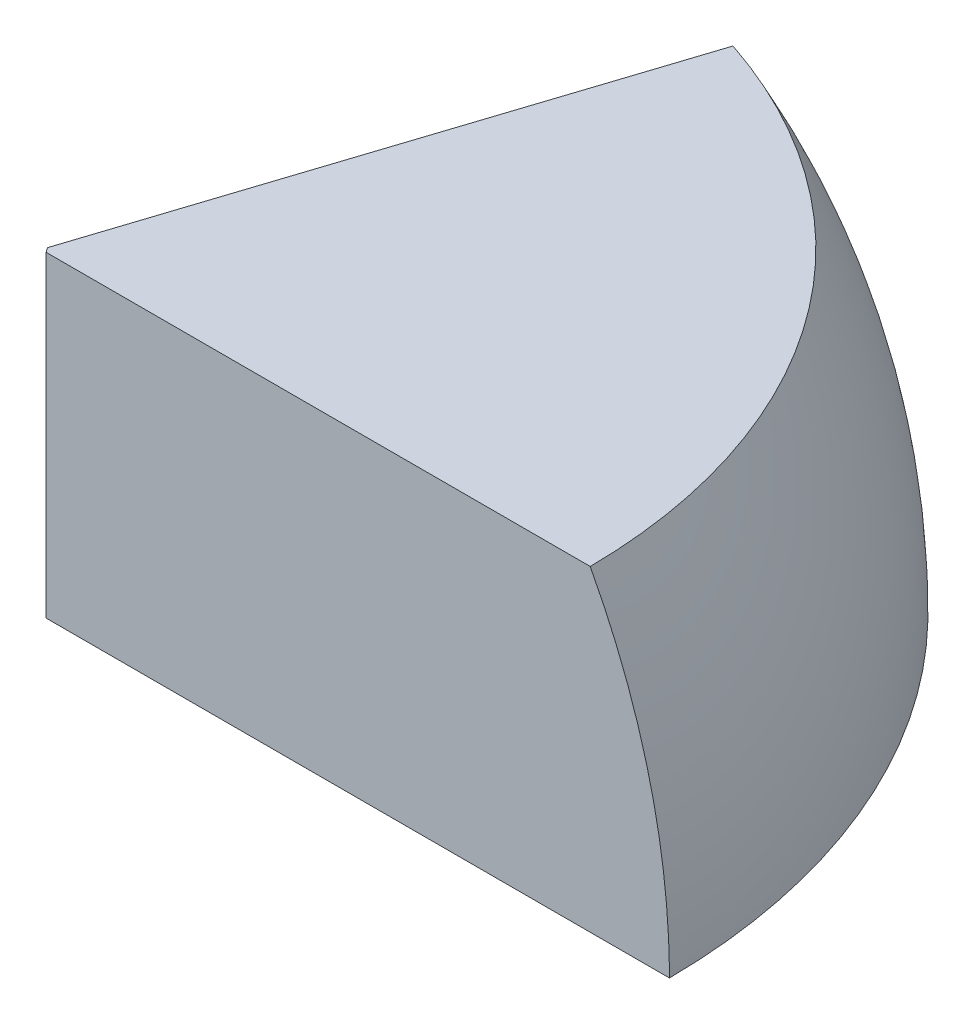
ISO-10303-21;
HEADER;
FILE_DESCRIPTION(('STEP AP214'),'2;1');
FILE_NAME('part.step','',(''),(''),'','','');
FILE_SCHEMA(('AUTOMOTIVE_DESIGN { 1 0 10303 214 1 1 1 1 }'));
ENDSEC;
DATA;
#1=APPLICATION_CONTEXT('core data for automotive mechanical design processes');
#2=APPLICATION_PROTOCOL_DEFINITION('international standard','automotive_design',2000,#1);
#3=PRODUCT_CONTEXT('',#1,'mechanical');
#4=PRODUCT('Part','Part','',(#3));
#5=PRODUCT_RELATED_PRODUCT_CATEGORY('part','',(#4));
#6=PRODUCT_DEFINITION_FORMATION('','',#4);
#7=PRODUCT_DEFINITION_CONTEXT('part definition',#1,'design');
#8=PRODUCT_DEFINITION('design','',#6,#7);
#9=PRODUCT_DEFINITION_SHAPE('','',#8);
#10=(LENGTH_UNIT() NAMED_UNIT(*) SI_UNIT(.MILLI.,.METRE.));
#11=(NAMED_UNIT(*) PLANE_ANGLE_UNIT() SI_UNIT($,.RADIAN.));
#12=(NAMED_UNIT(*) SI_UNIT($,.STERADIAN.) SOLID_ANGLE_UNIT());
#13=UNCERTAINTY_MEASURE_WITH_UNIT(LENGTH_MEASURE(1.E-05),#10,'distance_accuracy_value','');
#14=(GEOMETRIC_REPRESENTATION_CONTEXT(3) GLOBAL_UNCERTAINTY_ASSIGNED_CONTEXT((#13)) GLOBAL_UNIT_ASSIGNED_CONTEXT((#10,
#11,#12)) REPRESENTATION_CONTEXT('',''));
#15=CARTESIAN_POINT('',(0.,0.,0.));
#16=DIRECTION('',(0.,0.,1.));
#17=DIRECTION('',(1.,0.,0.));
#18=AXIS2_PLACEMENT_3D('',#15,#16,#17);
#19=CARTESIAN_POINT('',(0.,0.,0.));
#20=DIRECTION('',(0.,-1.,0.));
#21=DIRECTION('',(0.,0.,-1.));
#22=AXIS2_PLACEMENT_3D('',#19,#20,#21);
#23=PLANE('',#22);
#24=DIRECTION('',(-0.587785252292474,0.,-0.809016994374947));
#25=VECTOR('',#24,1.);
#26=CARTESIAN_POINT('',(1.11655093664301,0.,-1.38148727041144));
#27=LINE('',#26,#25);
#28=CARTESIAN_POINT('',(1.65890568521156,0.,-0.635));
#29=VERTEX_POINT('',#28);
#30=CARTESIAN_POINT('',(1.11655093664301,0.,-1.38148727041146));
#31=VERTEX_POINT('',#30);
#32=EDGE_CURVE('E48',#29,#31,#27,.T.);
#33=ORIENTED_EDGE('',*,*,#32,.T.);
#34=DIRECTION('',(-0.309016994374945,0.,0.951056516295154));
#35=VECTOR('',#34,1.);
#36=CARTESIAN_POINT('',(32.0000475163418,0.,-96.4311162641596));
#37=LINE('',#36,#35);
#38=CARTESIAN_POINT('',(31.9994343047552,0.,-96.4292289929545));
#39=VERTEX_POINT('',#38);
#40=EDGE_CURVE('E83',#39,#31,#37,.T.);
#41=ORIENTED_EDGE('',*,*,#40,.F.);
#42=CARTESIAN_POINT('',(0.,0.,0.));
#43=DIRECTION('',(0.,-1.,0.));
#44=DIRECTION('',(0.,0.,-1.));
#45=AXIS2_PLACEMENT_3D('',#42,#43,#44);
#46=CIRCLE('',#45,101.6);
#47=CARTESIAN_POINT('',(101.598015605621,0.,-0.635));
#48=VERTEX_POINT('',#47);
#49=EDGE_CURVE('E41',#39,#48,#46,.T.);
#50=ORIENTED_EDGE('',*,*,#49,.T.);
#51=DIRECTION('',(1.,0.,0.));
#52=VECTOR('',#51,1.);
#53=CARTESIAN_POINT('',(0.667678512391301,0.,-0.635));
#54=LINE('',#53,#52);
#55=EDGE_CURVE('E85',#29,#48,#54,.T.);
#56=ORIENTED_EDGE('',*,*,#55,.F.);
#57=EDGE_LOOP('',(#33,#41,#50,#56));
#58=FACE_BOUND('',#57,.T.);
#59=ADVANCED_FACE('F33',(#58),#23,.T.);
#60=CARTESIAN_POINT('',(0.,50.8,0.));
#61=DIRECTION('',(0.,1.,0.));
#62=DIRECTION('',(0.,0.,1.));
#63=AXIS2_PLACEMENT_3D('',#60,#61,#62);
#64=PLANE('',#63);
#65=DIRECTION('',(-0.587785252292474,0.,-0.809016994374947));
#66=VECTOR('',#65,1.);
#67=CARTESIAN_POINT('',(1.11655093664301,50.8,-1.38148727041144));
#68=LINE('',#67,#66);
#69=CARTESIAN_POINT('',(1.65890568521156,50.8,-0.635));
#70=VERTEX_POINT('',#69);
#71=CARTESIAN_POINT('',(1.11655093664301,50.8,-1.38148727041144));
#72=VERTEX_POINT('',#71);
#73=EDGE_CURVE('E75',#70,#72,#68,.T.);
#74=ORIENTED_EDGE('',*,*,#73,.F.);
#75=DIRECTION('',(-1.,0.,0.));
#76=VECTOR('',#75,1.);
#77=CARTESIAN_POINT('',(88.9,50.8,-0.635));
#78=LINE('',#77,#76);
#79=CARTESIAN_POINT('',(88.8977321139296,50.8,-0.635));
#80=VERTEX_POINT('',#79);
#81=EDGE_CURVE('E119',#80,#70,#78,.T.);
#82=ORIENTED_EDGE('',*,*,#81,.F.);
#83=CARTESIAN_POINT('',(0.,50.8,0.));
#84=DIRECTION('',(0.,-1.,0.));
#85=DIRECTION('',(0.,0.,-1.));
#86=AXIS2_PLACEMENT_3D('',#83,#84,#85);
#87=CIRCLE('',#86,88.9);
#88=CARTESIAN_POINT('',(28.074830872443,50.8,-84.3505416193857));
#89=VERTEX_POINT('',#88);
#90=EDGE_CURVE('E11',#89,#80,#87,.T.);
#91=ORIENTED_EDGE('',*,*,#90,.F.);
#92=DIRECTION('',(0.309016994374945,0.,-0.951056516295154));
#93=VECTOR('',#92,1.);
#94=CARTESIAN_POINT('',(0.603920887847423,50.8,0.19622579142809));
#95=LINE('',#94,#93);
#96=EDGE_CURVE('E56',#72,#89,#95,.T.);
#97=ORIENTED_EDGE('',*,*,#96,.F.);
#98=EDGE_LOOP('',(#74,#82,#91,#97));
#99=FACE_BOUND('',#98,.T.);
#100=ADVANCED_FACE('F35',(#99),#64,.T.);
#101=CARTESIAN_POINT('',(0.,0.,0.));
#102=DIRECTION('',(0.,-1.,0.));
#103=DIRECTION('',(0.,0.,-1.));
#104=AXIS2_PLACEMENT_3D('',#101,#102,#103);
#105=DEGENERATE_TOROIDAL_SURFACE('',#104,6.35000000000002,107.95,.F.);
#106=ORIENTED_EDGE('',*,*,#90,.T.);
#107=CARTESIAN_POINT('',(94.7999608499927,37.7022238875538,-0.635));
#108=CARTESIAN_POINT('',(95.3203908696051,36.3059902496333,-0.635));
#109=CARTESIAN_POINT('',(95.8118771845128,34.8990517011426,-0.635));
#110=CARTESIAN_POINT('',(96.7361397335234,32.0661800949635,-0.635));
#111=CARTESIAN_POINT('',(97.168923614608,30.6402495379324,-0.635));
#112=CARTESIAN_POINT('',(97.9751822661061,27.7713912898887,-0.635));
#113=CARTESIAN_POINT('',(98.348643967202,26.3284599284209,-0.635));
#114=CARTESIAN_POINT('',(99.0355206484872,23.4283195326901,-0.635));
#115=CARTESIAN_POINT('',(99.3489335450704,21.9711100048389,-0.635));
#116=CARTESIAN_POINT('',(99.9154613305407,19.0433948855513,-0.635));
#117=CARTESIAN_POINT('',(100.168511166463,17.5728767064404,-0.635));
#118=CARTESIAN_POINT('',(100.6134643388,14.6224834428879,-0.635));
#119=CARTESIAN_POINT('',(100.805362190253,13.1426075312486,-0.635));
#120=CARTESIAN_POINT('',(101.127630683367,10.1763554045649,-0.635));
#121=CARTESIAN_POINT('',(101.258008893998,8.68998001189637,-0.635));
#122=CARTESIAN_POINT('',(101.457058405799,5.71296530630253,-0.635));
#123=CARTESIAN_POINT('',(101.525723939242,4.22232560788919,-0.635));
#124=CARTESIAN_POINT('',(101.601859762706,1.21376058977976,-0.635));
#125=CARTESIAN_POINT('',(101.608254553608,-0.304192057610666,-0.635));
#126=CARTESIAN_POINT('',(101.557032755509,-3.33915976269332,-0.635));
#127=CARTESIAN_POINT('',(101.499410072898,-4.85617471737609,-0.635));
#128=CARTESIAN_POINT('',(101.320252547292,-7.88631835875365,-0.635));
#129=CARTESIAN_POINT('',(101.198722244482,-9.39944731384866,-0.635));
#130=CARTESIAN_POINT('',(100.891954210238,-12.4193759712748,-0.635));
#131=CARTESIAN_POINT('',(100.706710517596,-13.9261750680086,-0.635));
#132=CARTESIAN_POINT('',(100.272951479846,-16.9298977594043,-0.635));
#133=CARTESIAN_POINT('',(100.024466725546,-18.4268257707399,-0.635));
#134=CARTESIAN_POINT('',(99.4646011814536,-21.4090108637792,-0.635));
#135=CARTESIAN_POINT('',(99.1532145140556,-22.8942668413548,-0.635));
#136=CARTESIAN_POINT('',(98.4681335835209,-25.850209601262,-0.635));
#137=CARTESIAN_POINT('',(98.0944455918392,-27.3208978342598,-0.635));
#138=CARTESIAN_POINT('',(97.2854185769139,-30.2452587836484,-0.635));
#139=CARTESIAN_POINT('',(96.8500737869555,-31.698929894656,-0.635));
#140=CARTESIAN_POINT('',(95.4528377234414,-36.0298740204496,-0.635));
#141=CARTESIAN_POINT('',(94.3994739621603,-38.8782455936228,-0.635));
#142=CARTESIAN_POINT('',(92.0567206952393,-44.4758027316669,-0.635));
#143=CARTESIAN_POINT('',(90.7673300220942,-47.2249878058319,-0.635));
#144=CARTESIAN_POINT('',(87.9607473762117,-52.6067390140956,-0.635));
#145=CARTESIAN_POINT('',(86.4434109690583,-55.2392298270297,-0.635));
#146=CARTESIAN_POINT('',(83.1920506351196,-60.3672396774786,-0.635));
#147=CARTESIAN_POINT('',(81.4580290887038,-62.8627602192311,-0.635));
#148=CARTESIAN_POINT('',(78.7039542070773,-66.489855146637,-0.635));
#149=CARTESIAN_POINT('',(77.7600267570763,-67.6799610127351,-0.635));
#150=CARTESIAN_POINT('',(75.8228288096577,-70.0192607493527,-0.635));
#151=CARTESIAN_POINT('',(74.829562943604,-71.1684584425758,-0.635));
#152=CARTESIAN_POINT('',(72.7953090917599,-73.42405088478,-0.635));
#153=CARTESIAN_POINT('',(71.754314745944,-74.5304398928869,-0.635));
#154=CARTESIAN_POINT('',(69.6266626641089,-76.698210234682,-0.635));
#155=CARTESIAN_POINT('',(68.5400092237349,-77.7595957835402,-0.635));
#156=CARTESIAN_POINT('',(66.3245890887845,-79.8339781628021,-0.635));
#157=CARTESIAN_POINT('',(65.1958895543096,-80.8470467251894,-0.635));
#158=CARTESIAN_POINT('',(62.8969209227435,-82.8246420543714,-0.635));
#159=CARTESIAN_POINT('',(61.7266557305908,-83.7891733605924,-0.635));
#160=CARTESIAN_POINT('',(59.3465843351518,-85.6680429552838,-0.635));
#161=CARTESIAN_POINT('',(58.1367798120026,-86.5823833720931,-0.635));
#162=CARTESIAN_POINT('',(55.6798446306929,-88.3592093754092,-0.635));
#163=CARTESIAN_POINT('',(54.4327174699391,-89.2216997979953,-0.635));
#164=CARTESIAN_POINT('',(51.9044354476268,-90.8925991990847,-0.635));
#165=CARTESIAN_POINT('',(50.6233137804221,-91.7010584054202,-0.635));
#166=CARTESIAN_POINT('',(48.0283067432649,-93.2632789067282,-0.635));
#167=CARTESIAN_POINT('',(46.7144244423366,-94.0170452996619,-0.635));
#168=CARTESIAN_POINT('',(44.0554243349739,-95.4690012522521,-0.635));
#169=CARTESIAN_POINT('',(42.7102908134036,-96.1671620326812,-0.635));
#170=CARTESIAN_POINT('',(39.9919517355716,-97.5061751863875,-0.635));
#171=CARTESIAN_POINT('',(38.6187487996565,-98.1470328792975,-0.635));
#172=CARTESIAN_POINT('',(35.8411894560375,-99.3727565581276,-0.635));
#173=CARTESIAN_POINT('',(34.4367326158972,-99.9573949646777,-0.635));
#174=CARTESIAN_POINT('',(31.604311136439,-101.066819967976,-0.635));
#175=CARTESIAN_POINT('',(30.1763456164377,-101.591604316603,-0.635));
#176=CARTESIAN_POINT('',(27.3012151215215,-102.579771580649,-0.635));
#177=CARTESIAN_POINT('',(25.8540746889027,-103.043225948769,-0.635));
#178=CARTESIAN_POINT('',(22.9416621624144,-103.908584222053,-0.635));
#179=CARTESIAN_POINT('',(21.4763924342036,-104.31049606812,-0.635));
#180=CARTESIAN_POINT('',(19.1816761709061,-104.888119870422,-0.635));
#181=CARTESIAN_POINT('',(18.3575656466681,-105.085271750726,-0.635));
#182=CARTESIAN_POINT('',(16.704859249313,-105.460124421302,-0.635));
#183=CARTESIAN_POINT('',(15.8762630638558,-105.637823838314,-0.635));
#184=CARTESIAN_POINT('',(14.2135857945324,-105.973956279603,-0.635));
#185=CARTESIAN_POINT('',(13.3794974414568,-106.132353396563,-0.635));
#186=CARTESIAN_POINT('',(12.1258839468932,-106.355113988122,-0.635));
#187=CARTESIAN_POINT('',(11.707662641772,-106.426885284225,-0.635));
#188=CARTESIAN_POINT('',(10.8704056470081,-106.565481878848,-0.635));
#189=CARTESIAN_POINT('',(10.4513699699814,-106.632307253371,-0.635));
#190=CARTESIAN_POINT('',(9.61543192797793,-106.760555888908,-0.635));
#191=CARTESIAN_POINT('',(9.19853478818469,-106.822013236501,-0.635));
#192=CARTESIAN_POINT('',(8.36402499664367,-106.94002680085,-0.635));
#193=CARTESIAN_POINT('',(7.94641230865095,-106.996582761372,-0.635));
#194=CARTESIAN_POINT('',(7.11010503857731,-107.104829643146,-0.635));
#195=CARTESIAN_POINT('',(6.69140977816152,-107.156515324557,-0.635));
#196=CARTESIAN_POINT('',(5.85351033204919,-107.254917281929,-0.635));
#197=CARTESIAN_POINT('',(5.43430624841411,-107.301634427289,-0.635));
#198=CARTESIAN_POINT('',(4.59674689887297,-107.389917338872,-0.635));
#199=CARTESIAN_POINT('',(4.17839336859376,-107.43149952392,-0.635));
#200=CARTESIAN_POINT('',(3.5503783917972,-107.490058102203,-0.635));
#201=CARTESIAN_POINT('',(3.34089380415805,-107.508947146425,-0.635));
#202=CARTESIAN_POINT('',(2.92182611393838,-107.545405398607,-0.635));
#203=CARTESIAN_POINT('',(2.7122430204076,-107.562974710314,-0.635));
#204=CARTESIAN_POINT('',(2.29339780669155,-107.596684724307,-0.635));
#205=CARTESIAN_POINT('',(2.08413591934334,-107.612828306571,-0.635));
#206=CARTESIAN_POINT('',(1.77012355845447,-107.635843556175,-0.635));
#207=CARTESIAN_POINT('',(1.6654170208456,-107.643316323744,-0.635));
#208=CARTESIAN_POINT('',(1.45597349782732,-107.657797219578,-0.635));
#209=CARTESIAN_POINT('',(1.35123651296697,-107.664805355756,-0.635));
#210=CARTESIAN_POINT('',(1.14185746907192,-107.678232926634,-0.635));
#211=CARTESIAN_POINT('',(1.03721545767713,-107.684653095224,-0.635));
#212=CARTESIAN_POINT('',(0.8278756101987,-107.696672183818,-0.635));
#213=CARTESIAN_POINT('',(0.72317777030646,-107.702271037821,-0.635));
#214=CARTESIAN_POINT('',(0.513779070818093,-107.712089897921,-0.635));
#215=CARTESIAN_POINT('',(0.409078256436661,-107.71631078816,-0.635));
#216=CARTESIAN_POINT('',(0.251981511151455,-107.720750223907,-0.635));
#217=CARTESIAN_POINT('',(0.199613355256506,-107.721914698276,-0.635));
#218=CARTESIAN_POINT('',(0.0948658082523143,-107.723453214523,-0.635));
#219=CARTESIAN_POINT('',(0.0424864173559474,-107.723827270247,-0.635));
#220=CARTESIAN_POINT('',(-0.0815062755837158,-107.723698022747,-0.635));
#221=CARTESIAN_POINT('',(-0.153119357342319,-107.722822099632,-0.635));
#222=CARTESIAN_POINT('',(-0.296317215844109,-107.719714883284,-0.635));
#223=CARTESIAN_POINT('',(-0.367901990830503,-107.71748351613,-0.635));
#224=CARTESIAN_POINT('',(-0.511057884739,-107.712097345129,-0.635));
#225=CARTESIAN_POINT('',(-0.582628992127263,-107.708942248599,-0.635));
#226=CARTESIAN_POINT('',(-0.72573957207395,-107.702016907282,-0.635));
#227=CARTESIAN_POINT('',(-0.797279045126111,-107.698246672463,-0.635));
#228=CARTESIAN_POINT('',(-1.01199020191181,-107.686300355041,-0.635));
#229=CARTESIAN_POINT('',(-1.1551265295606,-107.677494281422,-0.635));
#230=CARTESIAN_POINT('',(-1.44133325497695,-107.658868034849,-0.635));
#231=CARTESIAN_POINT('',(-1.58440365189501,-107.649047849179,-0.635));
#232=CARTESIAN_POINT('',(-2.01405616604885,-107.618372585246,-0.635));
#233=CARTESIAN_POINT('',(-2.30055421672521,-107.596334515299,-0.635));
#234=CARTESIAN_POINT('',(-2.87321174554093,-107.549718964377,-0.635));
#235=CARTESIAN_POINT('',(-3.15937131804109,-107.525142631204,-0.635));
#236=CARTESIAN_POINT('',(-3.7323586285459,-107.473494108956,-0.635));
#237=CARTESIAN_POINT('',(-4.0191856916271,-107.446414426873,-0.635));
#238=CARTESIAN_POINT('',(-4.59264485229592,-107.389888845311,-0.635));
#239=CARTESIAN_POINT('',(-4.87927691887871,-107.360442631597,-0.635));
#240=CARTESIAN_POINT('',(-5.45202241474948,-107.299244056064,-0.635));
#241=CARTESIAN_POINT('',(-5.73813607830052,-107.267493886618,-0.635));
#242=CARTESIAN_POINT('',(-6.31008593880938,-107.201681404066,-0.635));
#243=CARTESIAN_POINT('',(-6.59592214617062,-107.16761918134,-0.635));
#244=CARTESIAN_POINT('',(-7.16878170732417,-107.097010573791,-0.635));
#245=CARTESIAN_POINT('',(-7.45580359708506,-107.060452302903,-0.635));
#246=CARTESIAN_POINT('',(-8.02954499846895,-106.985016356498,-0.635));
#247=CARTESIAN_POINT('',(-8.31626450660629,-106.946138654537,-0.635));
#248=CARTESIAN_POINT('',(-9.17610232394604,-106.826012836026,-0.635));
#249=CARTESIAN_POINT('',(-9.74873953976329,-106.741291779633,-0.635));
#250=CARTESIAN_POINT('',(-10.8915955554142,-106.562781498174,-0.635));
#251=CARTESIAN_POINT('',(-11.4618168140194,-106.469007981482,-0.635));
#252=CARTESIAN_POINT('',(-12.6006254450879,-106.27231206019,-0.635));
#253=CARTESIAN_POINT('',(-13.1692129641212,-106.169390504551,-0.635));
#254=CARTESIAN_POINT('',(-14.3104710596791,-105.953321874614,-0.635));
#255=CARTESIAN_POINT('',(-14.8831238642747,-105.840080924232,-0.635));
#256=CARTESIAN_POINT('',(-16.0265319711474,-105.604315069928,-0.635));
#257=CARTESIAN_POINT('',(-16.5972872179175,-105.481789896877,-0.635));
#258=CARTESIAN_POINT('',(-17.737056298021,-105.227420236905,-0.635));
#259=CARTESIAN_POINT('',(-18.3060689700742,-105.09557054223,-0.635));
#260=CARTESIAN_POINT('',(-19.4418677285236,-104.822652317661,-0.635));
#261=CARTESIAN_POINT('',(-20.0086538333204,-104.681583864123,-0.635));
#262=CARTESIAN_POINT('',(-21.7019713746198,-104.245501158962,-0.635));
#263=CARTESIAN_POINT('',(-22.8250179256101,-103.936815750552,-0.635));
#264=CARTESIAN_POINT('',(-25.060308303512,-103.283327219395,-0.635));
#265=CARTESIAN_POINT('',(-26.172553915032,-102.938530178167,-0.635));
#266=CARTESIAN_POINT('',(-28.7238154417926,-102.102152656675,-0.635));
#267=CARTESIAN_POINT('',(-30.1587107931364,-101.597935699088,-0.635));
#268=CARTESIAN_POINT('',(-33.0060585030182,-100.529275780374,-0.635));
#269=CARTESIAN_POINT('',(-34.4185082176264,-99.964825783777,-0.635));
#270=CARTESIAN_POINT('',(-37.220319165171,-98.7758932218178,-0.635));
#271=CARTESIAN_POINT('',(-38.6096442397228,-98.1513254184676,-0.635));
#272=CARTESIAN_POINT('',(-41.3605725038295,-96.8439870934439,-0.635));
#273=CARTESIAN_POINT('',(-42.7221766831106,-96.1612186542534,-0.635));
#274=CARTESIAN_POINT('',(-45.4068108040488,-94.7431554599081,-0.635));
#275=CARTESIAN_POINT('',(-46.7300294310542,-94.0082178919763,-0.635));
#276=CARTESIAN_POINT('',(-49.3445178697212,-92.4832879767298,-0.635));
#277=CARTESIAN_POINT('',(-50.6357847189394,-91.6932905502053,-0.635));
#278=CARTESIAN_POINT('',(-53.1831816801979,-90.0601971031479,-0.635));
#279=CARTESIAN_POINT('',(-54.4393327283881,-89.2171337396873,-0.635));
#280=CARTESIAN_POINT('',(-56.9152131370232,-87.4788843384787,-0.635));
#281=CARTESIAN_POINT('',(-58.1349390906094,-86.5836934481706,-0.635));
#282=CARTESIAN_POINT('',(-60.5378476124949,-84.7411892120182,-0.635));
#283=CARTESIAN_POINT('',(-61.7209606391187,-83.7937851711993,-0.635));
#284=CARTESIAN_POINT('',(-64.0463590016206,-81.8499156593288,-0.635));
#285=CARTESIAN_POINT('',(-65.1886405138327,-80.8534456141582,-0.635));
#286=CARTESIAN_POINT('',(-67.4303186829574,-78.8132157314197,-0.635));
#287=CARTESIAN_POINT('',(-68.5297120916531,-77.7694523248837,-0.635));
#288=CARTESIAN_POINT('',(-70.6836730975092,-75.6364581337761,-0.635));
#289=CARTESIAN_POINT('',(-71.7382364817991,-74.5472230950193,-0.635));
#290=CARTESIAN_POINT('',(-73.8028644098802,-72.3228227280075,-0.635));
#291=CARTESIAN_POINT('',(-74.8128241890917,-71.1875601515797,-0.635));
#292=CARTESIAN_POINT('',(-76.7840174321944,-68.8753179255673,-0.635));
#293=CARTESIAN_POINT('',(-77.7452463064922,-67.6983343642733,-0.635));
#294=CARTESIAN_POINT('',(-79.6170450179246,-65.304988909511,-0.635));
#295=CARTESIAN_POINT('',(-80.527622097675,-64.0886326854245,-0.635));
#296=CARTESIAN_POINT('',(-82.2966644088901,-61.6185514576497,-0.635));
#297=CARTESIAN_POINT('',(-83.1551247539837,-60.3648229663853,-0.635));
#298=CARTESIAN_POINT('',(-85.6485683158174,-56.5530091201908,-0.635));
#299=CARTESIAN_POINT('',(-87.2035112775105,-53.941868817191,-0.635));
#300=CARTESIAN_POINT('',(-90.0876089237531,-48.5981517036838,-0.635));
#301=CARTESIAN_POINT('',(-91.4167606178773,-45.86557328543,-0.635));
#302=CARTESIAN_POINT('',(-93.8391330593218,-40.3002592562702,-0.635));
#303=CARTESIAN_POINT('',(-94.9325419081043,-37.4676056126787,-0.635));
#304=CARTESIAN_POINT('',(-96.8769221683115,-31.7203226100261,-0.635));
#305=CARTESIAN_POINT('',(-97.727894641608,-28.8056936100787,-0.635));
#306=CARTESIAN_POINT('',(-99.1815874719308,-22.9143033267797,-0.635));
#307=CARTESIAN_POINT('',(-99.7842388080103,-19.9375250102392,-0.635));
#308=CARTESIAN_POINT('',(-100.736660649044,-13.9437822646685,-0.635));
#309=CARTESIAN_POINT('',(-101.086430740594,-10.9268177699511,-0.635));
#310=CARTESIAN_POINT('',(-101.530659903979,-4.87338734458267,-0.635));
#311=CARTESIAN_POINT('',(-101.62505482903,-1.83691670620862,-0.635));
#312=CARTESIAN_POINT('',(-101.5576777081,4.23318014532309,-0.635));
#313=CARTESIAN_POINT('',(-101.395905722968,7.26680635915625,-0.635));
#314=CARTESIAN_POINT('',(-100.817362496594,13.309465073422,-0.635));
#315=CARTESIAN_POINT('',(-100.400606238885,16.3184990084325,-0.635));
#316=CARTESIAN_POINT('',(-99.3150705946959,22.2907585784562,-0.635));
#317=CARTESIAN_POINT('',(-98.6462912054986,25.2539842129753,-0.635));
#318=CARTESIAN_POINT('',(-97.0615694681184,31.113169745415,-0.635));
#319=CARTESIAN_POINT('',(-96.1456598062,34.0091384839795,-0.635));
#320=CARTESIAN_POINT('',(-94.0731492247841,39.7136283999965,-0.635));
#321=CARTESIAN_POINT('',(-92.9165484274562,42.5221496218346,-0.635));
#322=CARTESIAN_POINT('',(-90.3709249038534,48.0316776889205,-0.635));
#323=CARTESIAN_POINT('',(-88.9819109388817,50.7326885822468,-0.635));
#324=CARTESIAN_POINT('',(-85.9813013625798,56.0081132470939,-0.635));
#325=CARTESIAN_POINT('',(-84.3697054151412,58.5825268274394,-0.635));
#326=CARTESIAN_POINT('',(-80.9350304629028,63.5869750609386,-0.635));
#327=CARTESIAN_POINT('',(-79.111907497864,66.0169795432718,-0.635));
#328=CARTESIAN_POINT('',(-75.267422175166,70.7147359187964,-0.635));
#329=CARTESIAN_POINT('',(-73.2460608242078,72.9824886358392,-0.635));
#330=CARTESIAN_POINT('',(-69.0193463301026,77.3397509203423,-0.635));
#331=CARTESIAN_POINT('',(-66.813982927465,79.4292505357041,-0.635));
#332=CARTESIAN_POINT('',(-62.234999613897,83.4150441854375,-0.635));
#333=CARTESIAN_POINT('',(-59.8613763870261,85.3113344103849,-0.635));
#334=CARTESIAN_POINT('',(-54.9635523708263,88.896619655435,-0.635));
#335=CARTESIAN_POINT('',(-52.4393983902613,90.5856786214429,-0.635));
#336=CARTESIAN_POINT('',(-47.2579722002027,93.7450641553903,-0.635));
#337=CARTESIAN_POINT('',(-44.6007096755333,95.2154066060805,-0.635));
#338=CARTESIAN_POINT('',(-39.1711422194304,97.9273757787988,-0.635));
#339=CARTESIAN_POINT('',(-36.3988097390198,99.1689473391163,-0.635));
#340=CARTESIAN_POINT('',(-30.7586274946656,101.414406491842,-0.635));
#341=CARTESIAN_POINT('',(-27.8907534187383,102.41823305132,-0.635));
#342=CARTESIAN_POINT('',(-22.0808632941162,104.180546509588,-0.635));
#343=CARTESIAN_POINT('',(-19.1388492902409,104.939040166827,-0.635));
#344=CARTESIAN_POINT('',(-13.2032703975664,106.204918902852,-0.635));
#345=CARTESIAN_POINT('',(-10.2097525815082,106.712521857278,-0.635));
#346=CARTESIAN_POINT('',(-6.6022690836587,107.168177166057,-0.635));
#347=CARTESIAN_POINT('',(-6.00259085988139,107.238786183432,-0.635));
#348=CARTESIAN_POINT('',(-5.10207907316328,107.337048275408,-0.635));
#349=CARTESIAN_POINT('',(-4.80167233744886,107.368533537322,-0.635));
#350=CARTESIAN_POINT('',(-4.20061803218472,107.428914074967,-0.635));
#351=CARTESIAN_POINT('',(-3.89997047828671,107.457809507106,-0.635));
#352=CARTESIAN_POINT('',(-3.4492270895494,107.49912626361,-0.635));
#353=CARTESIAN_POINT('',(-3.29922220291712,107.512543818095,-0.635));
#354=CARTESIAN_POINT('',(-2.9991525886539,107.538703602183,-0.635));
#355=CARTESIAN_POINT('',(-2.84908786068692,107.551445827939,-0.635));
#356=CARTESIAN_POINT('',(-2.54885979573177,107.576231971124,-0.635));
#357=CARTESIAN_POINT('',(-2.3986964430423,107.588275698411,-0.635));
#358=CARTESIAN_POINT('',(-2.09831488294492,107.611613438189,-0.635));
#359=CARTESIAN_POINT('',(-1.94809667692269,107.622907468456,-0.635));
#360=CARTESIAN_POINT('',(-1.64774919421287,107.644631520713,-0.635));
#361=CARTESIAN_POINT('',(-1.49761997936192,107.655062397592,-0.635));
#362=CARTESIAN_POINT('',(-1.19727229898293,107.674857039249,-0.635));
#363=CARTESIAN_POINT('',(-1.04705382522838,107.684220682182,-0.635));
#364=CARTESIAN_POINT('',(-0.82169267494128,107.696934890345,-0.635));
#365=CARTESIAN_POINT('',(-0.746587844714646,107.700950141467,-0.635));
#366=CARTESIAN_POINT('',(-0.596343192596915,107.708324913075,-0.635));
#367=CARTESIAN_POINT('',(-0.521203369815249,107.711684415844,-0.635));
#368=CARTESIAN_POINT('',(-0.370904953725448,107.717399059465,-0.635));
#369=CARTESIAN_POINT('',(-0.295746371849262,107.719754485948,-0.635));
#370=CARTESIAN_POINT('',(-0.14540376384326,107.722961247263,-0.635));
#371=CARTESIAN_POINT('',(-0.070219742354322,107.723812779685,-0.635));
#372=CARTESIAN_POINT('',(0.070147413739791,107.723744877219,-0.635));
#373=CARTESIAN_POINT('',(0.13533071835166,107.723045920975,-0.635));
#374=CARTESIAN_POINT('',(0.265675636565372,107.720492929133,-0.635));
#375=CARTESIAN_POINT('',(0.330837249195149,107.718638847327,-0.635));
#376=CARTESIAN_POINT('',(0.46114321297079,107.7140965922,-0.635));
#377=CARTESIAN_POINT('',(0.526287557986862,107.711408250771,-0.635));
#378=CARTESIAN_POINT('',(0.656548756483506,107.705457371661,-0.635));
#379=CARTESIAN_POINT('',(0.721665610220821,107.702194839466,-0.635));
#380=CARTESIAN_POINT('',(0.917069902824192,107.691808389161,-0.635));
#381=CARTESIAN_POINT('',(1.04732538433927,107.684089126451,-0.635));
#382=CARTESIAN_POINT('',(1.30776153877364,107.667711555744,-0.635));
#383=CARTESIAN_POINT('',(1.43794221822136,107.659053348618,-0.635));
#384=CARTESIAN_POINT('',(1.8288377762719,107.631997425827,-0.635));
#385=CARTESIAN_POINT('',(2.08947978624861,107.612543304773,-0.635));
#386=CARTESIAN_POINT('',(2.61050082540838,107.571462312334,-0.635));
#387=CARTESIAN_POINT('',(2.87087991405047,107.549836186442,-0.635));
#388=CARTESIAN_POINT('',(3.39226700545465,107.504479214216,-0.635));
#389=CARTESIAN_POINT('',(3.6532744598731,107.480742059615,-0.635));
#390=CARTESIAN_POINT('',(4.17512837388475,107.431291494747,-0.635));
#391=CARTESIAN_POINT('',(4.43597481459923,107.405577885528,-0.635));
#392=CARTESIAN_POINT('',(4.95725412747506,107.352228745807,-0.635));
#393=CARTESIAN_POINT('',(5.21768716331497,107.324594815633,-0.635));
#394=CARTESIAN_POINT('',(5.73833372235408,107.267404972845,-0.635));
#395=CARTESIAN_POINT('',(5.99854725182847,107.237849117201,-0.635));
#396=CARTESIAN_POINT('',(6.78170000243932,107.145979793296,-0.635));
#397=CARTESIAN_POINT('',(7.30430097205468,107.080756421039,-0.635));
#398=CARTESIAN_POINT('',(8.34862190986432,106.942612359346,-0.635));
#399=CARTESIAN_POINT('',(8.87034161044627,106.869689651609,-0.635));
#400=CARTESIAN_POINT('',(9.91176003126915,106.716323507585,-0.635));
#401=CARTESIAN_POINT('',(10.4314606833489,106.635893195708,-0.635));
#402=CARTESIAN_POINT('',(11.4695847980769,106.467439125677,-0.635));
#403=CARTESIAN_POINT('',(11.9880083643489,106.379416005986,-0.635));
#404=CARTESIAN_POINT('',(13.0293754190861,106.194754200499,-0.635));
#405=CARTESIAN_POINT('',(13.5523036121542,106.0980292395,-0.635));
#406=CARTESIAN_POINT('',(14.5966854885112,105.89685245843,-0.635));
#407=CARTESIAN_POINT('',(15.118139132428,105.792400434023,-0.635));
#408=CARTESIAN_POINT('',(16.1597487154436,105.575733049053,-0.635));
#409=CARTESIAN_POINT('',(16.6799037237321,105.463513209953,-0.635));
#410=CARTESIAN_POINT('',(17.718488029937,105.23139254003,-0.635));
#411=CARTESIAN_POINT('',(18.2369173406867,105.111491766462,-0.635));
#412=CARTESIAN_POINT('',(19.7859387222623,104.741146259772,-0.635));
#413=CARTESIAN_POINT('',(20.8138360816529,104.479315136698,-0.635));
#414=CARTESIAN_POINT('',(22.8612565345892,103.925524362671,-0.635));
#415=CARTESIAN_POINT('',(23.8807810486675,103.633569941394,-0.635));
#416=CARTESIAN_POINT('',(26.3517592785539,102.886397120097,-0.635));
#417=CARTESIAN_POINT('',(27.7984604065271,102.415348618568,-0.635));
#418=CARTESIAN_POINT('',(30.670826433077,101.412469446761,-0.635));
#419=CARTESIAN_POINT('',(32.096488407925,100.880630416817,-0.635));
#420=CARTESIAN_POINT('',(34.926513281361,99.7561920060578,-0.635));
#421=CARTESIAN_POINT('',(36.3308350609055,99.1634890908446,-0.635));
#422=CARTESIAN_POINT('',(39.1130627238541,97.919181105661,-0.635));
#423=CARTESIAN_POINT('',(40.490969724983,97.2675785346902,-0.635));
#424=CARTESIAN_POINT('',(43.2078893671866,95.9116451772892,-0.635));
#425=CARTESIAN_POINT('',(44.5471140877874,95.2077393033789,-0.635));
#426=CARTESIAN_POINT('',(47.1948033909071,93.7442644102563,-0.635));
#427=CARTESIAN_POINT('',(48.5032678629799,92.9846951912224,-0.635));
#428=CARTESIAN_POINT('',(51.086281470213,91.4117487477772,-0.635));
#429=CARTESIAN_POINT('',(52.3608520424893,90.5984067258976,-0.635));
#430=CARTESIAN_POINT('',(54.8747056566711,88.9189130205396,-0.635));
#431=CARTESIAN_POINT('',(56.113988804356,88.0527614953902,-0.635));
#432=CARTESIAN_POINT('',(58.558221084532,86.2668835224486,-0.635));
#433=CARTESIAN_POINT('',(59.7630738388272,85.3470251629411,-0.635));
#434=CARTESIAN_POINT('',(62.1330757775709,83.4573159237916,-0.635));
#435=CARTESIAN_POINT('',(63.2982217157309,82.4874609728155,-0.635));
#436=CARTESIAN_POINT('',(65.5868901799874,80.4993307083454,-0.635));
#437=CARTESIAN_POINT('',(66.7104035655998,79.4810448725357,-0.635));
#438=CARTESIAN_POINT('',(68.9135449103075,77.3980562780263,-0.635));
#439=CARTESIAN_POINT('',(69.9931728503047,76.3333534991273,-0.635));
#440=CARTESIAN_POINT('',(72.1088712916444,74.1571116271722,-0.635));
#441=CARTESIAN_POINT('',(73.1448444785038,73.0454779204539,-0.635));
#442=CARTESIAN_POINT('',(75.1688596939153,70.7795757374579,-0.635));
#443=CARTESIAN_POINT('',(76.1569057747911,69.6253108803085,-0.635));
#444=CARTESIAN_POINT('',(78.0832317126161,67.2763136290238,-0.635));
#445=CARTESIAN_POINT('',(79.021520874917,66.0815888705178,-0.635));
#446=CARTESIAN_POINT('',(80.8467773790007,63.6537240181602,-0.635));
#447=CARTESIAN_POINT('',(81.7337468296489,62.4205855060413,-0.635));
#448=CARTESIAN_POINT('',(83.8472391219321,59.3473964722819,-0.635));
#449=CARTESIAN_POINT('',(85.0442766288282,57.4868853253884,-0.635));
#450=CARTESIAN_POINT('',(86.7521143535312,54.6442001940355,-0.635));
#451=CARTESIAN_POINT('',(87.3067438188941,53.6880431369542,-0.635));
#452=CARTESIAN_POINT('',(88.3864607288035,51.7590098950474,-0.635));
#453=CARTESIAN_POINT('',(88.9115441929151,50.78613148046,-0.635));
#454=CARTESIAN_POINT('',(90.4405664207206,47.845940559459,-0.635));
#455=CARTESIAN_POINT('',(91.3995163448817,45.855009172417,-0.635));
#456=CARTESIAN_POINT('',(93.1935017529195,41.8179692399302,-0.635));
#457=CARTESIAN_POINT('',(94.0285289247128,39.7718570041134,-0.635));
#458=CARTESIAN_POINT('',(94.7999608499927,37.7022238875538,-0.635));
#459=B_SPLINE_CURVE_WITH_KNOTS('',3,(#107,#108,#109,#110,#111,#112,#113,#114,#115,#116,#117,
#118,#119,#120,#121,#122,#123,#124,#125,#126,#127,#128,#129,#130,#131,#132,#133,#134,#135,#136,
#137,#138,#139,#140,#141,#142,#143,#144,#145,#146,#147,#148,#149,#150,#151,#152,#153,#154,#155,
#156,#157,#158,#159,#160,#161,#162,#163,#164,#165,#166,#167,#168,#169,#170,#171,#172,#173,#174,
#175,#176,#177,#178,#179,#180,#181,#182,#183,#184,#185,#186,#187,#188,#189,#190,#191,#192,#193,
#194,#195,#196,#197,#198,#199,#200,#201,#202,#203,#204,#205,#206,#207,#208,#209,#210,#211,#212,
#213,#214,#215,#216,#217,#218,#219,#220,#221,#222,#223,#224,#225,#226,#227,#228,#229,#230,#231,
#232,#233,#234,#235,#236,#237,#238,#239,#240,#241,#242,#243,#244,#245,#246,#247,#248,#249,#250,
#251,#252,#253,#254,#255,#256,#257,#258,#259,#260,#261,#262,#263,#264,#265,#266,#267,#268,#269,
#270,#271,#272,#273,#274,#275,#276,#277,#278,#279,#280,#281,#282,#283,#284,#285,#286,#287,#288,
#289,#290,#291,#292,#293,#294,#295,#296,#297,#298,#299,#300,#301,#302,#303,#304,#305,#306,#307,
#308,#309,#310,#311,#312,#313,#314,#315,#316,#317,#318,#319,#320,#321,#322,#323,#324,#325,#326,
#327,#328,#329,#330,#331,#332,#333,#334,#335,#336,#337,#338,#339,#340,#341,#342,#343,#344,#345,
#346,#347,#348,#349,#350,#351,#352,#353,#354,#355,#356,#357,#358,#359,#360,#361,#362,#363,#364,
#365,#366,#367,#368,#369,#370,#371,#372,#373,#374,#375,#376,#377,#378,#379,#380,#381,#382,#383,
#384,#385,#386,#387,#388,#389,#390,#391,#392,#393,#394,#395,#396,#397,#398,#399,#400,#401,#402,
#403,#404,#405,#406,#407,#408,#409,#410,#411,#412,#413,#414,#415,#416,#417,#418,#419,#420,#421,
#422,#423,#424,#425,#426,#427,#428,#429,#430,#431,#432,#433,#434,#435,#436,#437,#438,#439,#440,
#441,#442,#443,#444,#445,#446,#447,#448,#449,#450,#451,#452,#453,#454,#455,#456,#457,#458),
.UNSPECIFIED.,.T.,.F.,(4,2,2,2,2,2,2,2,2,2,2,2,2,2,2,2,2,2,2,2,2,2,2,2,2,2,2,2,2,2,2,2,2,2,2,2,
2,2,2,2,2,2,2,2,2,2,2,2,2,2,2,2,2,2,2,2,2,2,2,2,2,2,2,2,2,2,2,2,2,2,2,2,2,2,2,2,2,2,2,2,2,2,2,2,
2,2,2,2,2,2,2,2,2,2,2,2,2,2,2,2,2,2,2,2,2,2,2,2,2,2,2,2,2,2,2,2,2,2,2,2,2,2,2,2,2,2,2,2,2,2,2,2,
2,2,2,2,2,2,2,2,2,2,2,2,2,2,2,2,2,2,2,2,2,2,2,2,2,2,2,2,2,2,2,2,2,2,2,2,2,2,2,2,2,2,2,4),(0.,
4.46976242737257,8.93894203248488,13.4091048846471,17.8794228168774,22.354536840156,
26.8300521410144,31.3050166604102,35.7803993709434,40.3329436301503,44.8859212680279,
49.4385754926146,53.9916557925194,58.5425378598783,63.0938453622013,67.6446949913353,
72.1959705394999,81.2949368254813,90.393948120642,99.4987493779841,108.603450624376,
113.159332764695,117.714788052636,122.270852148984,126.826488562629,131.375136499262,
135.923358231858,140.471386948406,145.018990807396,149.562306622802,154.105198406616,
158.65042633263,163.195231871271,167.757722226775,172.320383893194,176.87768211567,
181.434391808216,183.976283588647,186.518354699925,189.06508478546,190.338065353419,
191.611026355559,192.875205758994,194.139451211252,195.405041671622,196.670410311988,
197.931622038721,198.562622051612,199.19357240894,199.823217612108,200.138135389065,
200.453047801595,200.767561630898,201.082100720684,201.396437594266,201.553575961595,
201.710711576343,201.925549784853,202.140399710735,202.355317785463,202.570232378249,
203.000446185524,203.430665389115,204.292682743468,205.154311986862,206.018609351529,
206.883021670115,207.746621962385,208.61018851532,209.478200835517,210.346223054578,
212.082752237554,213.816320478477,215.549728007623,217.30087685013,219.052076473936,
220.804261988401,222.556432992168,226.049849870541,229.542679369794,234.103979514628,
238.665813022678,243.234212566526,247.802448716555,252.341966838938,256.881904282428,
261.41907463381,265.956668028446,270.502408211862,275.048572971707,279.595081378681,
284.142016100378,288.699117091449,293.256646486875,297.813522524695,302.370825149274,
311.476219210694,320.581733856399,329.679956014637,338.77813832203,347.878847769293,
356.979572094166,366.08258218561,375.185590114745,384.28806317903,393.390536341477,
402.491806170472,411.59307137987,420.693993575191,429.79492951344,438.8977602374,
448.000544737444,457.103837125427,466.207308964288,475.307964617476,484.407959076509,
493.510144881867,502.614664836688,511.718933958134,520.815282901911,522.626718970732,
523.532861098649,524.438948464825,524.890758471071,525.342571051249,525.79450605033,
526.246430329246,526.697901515642,527.149424194561,527.375058659,527.600699219554,
527.826275549078,528.051822238782,528.247370817375,528.442927218878,528.63852305148,
528.8341170151,529.225562202774,529.616965379075,530.401053002362,531.184872418409,
531.971118277859,532.757443385155,533.543120878171,534.328775092811,535.908678631276,
537.488997357898,539.066603422383,540.644076958749,542.239413805293,543.834792854344,
545.431099506927,547.027394261746,550.209042988507,553.390140278828,557.953070705185,
562.516629363744,567.088083809977,571.659344389101,576.196847865645,580.734367631825,
585.268945760349,589.803510294362,594.349723583018,598.896307666584,603.443884114948,
607.99146254231,612.548693213287,617.105537888082,621.661527331543,626.217329423949,
632.849497453008,636.165191741735,639.481331656277,646.106403507228,652.731919532341),.UNSPECIFIED.);
#460=EDGE_CURVE('E91',#80,#48,#459,.T.);
#461=ORIENTED_EDGE('',*,*,#460,.T.);
#462=ORIENTED_EDGE('',*,*,#49,.F.);
#463=CARTESIAN_POINT('',(31.9994343046979,-0.00019999999998678,-96.4292289927783));
#464=CARTESIAN_POINT('',(31.9994417586177,1.53244638510875,-96.4292519335844));
#465=CARTESIAN_POINT('',(31.989349741781,3.06509146527585,-96.3981918995093));
#466=CARTESIAN_POINT('',(31.9490137204242,6.12761869883829,-96.2740503906243));
#467=CARTESIAN_POINT('',(31.9187695014563,7.65750082265817,-96.1809682558122));
#468=CARTESIAN_POINT('',(31.838161048792,10.7122768812055,-95.9328809480902));
#469=CARTESIAN_POINT('',(31.7877893384578,12.2371687497806,-95.777852764455));
#470=CARTESIAN_POINT('',(31.6670201370774,15.2786048555945,-95.4061633815688));
#471=CARTESIAN_POINT('',(31.5966229368096,16.7951492137166,-95.1895030772416));
#472=CARTESIAN_POINT('',(31.4375506555762,19.786678844504,-94.6999289360683));
#473=CARTESIAN_POINT('',(31.349272790096,21.2618854724897,-94.4282376027831));
#474=CARTESIAN_POINT('',(31.1537671297582,24.1990889057013,-93.8265330505367));
#475=CARTESIAN_POINT('',(31.0465393803117,25.6610857425739,-93.4965199713368));
#476=CARTESIAN_POINT('',(30.8133721170771,28.5686834317406,-92.7789049238717));
#477=CARTESIAN_POINT('',(30.6874408086877,30.0142911762188,-92.3913282092268));
#478=CARTESIAN_POINT('',(30.4170632479685,32.8871119455903,-91.5591916417795));
#479=CARTESIAN_POINT('',(30.2726188383068,34.3143267856499,-91.1146374601269));
#480=CARTESIAN_POINT('',(29.9792651313207,37.0206399795264,-90.2117875855664));
#481=CARTESIAN_POINT('',(29.8319239980915,38.3015214879205,-89.7583182054781));
#482=CARTESIAN_POINT('',(29.5223509559072,40.8440055331829,-88.805550349994));
#483=CARTESIAN_POINT('',(29.3601220870842,42.1056119449921,-88.3062612311629));
#484=CARTESIAN_POINT('',(29.0193944806147,44.6196932875759,-87.2576094860708));
#485=CARTESIAN_POINT('',(28.8407577101563,45.8719723187068,-86.7078220384966));
#486=CARTESIAN_POINT('',(28.4687537882867,48.3537217174616,-85.5629116923941));
#487=CARTESIAN_POINT('',(28.2753836249346,49.5831873571279,-84.9677795240644));
#488=CARTESIAN_POINT('',(28.074797909706,50.8002,-84.3504401705128));
#489=B_SPLINE_CURVE_WITH_KNOTS('',3,(#463,#464,#465,#466,#467,#468,#469,#470,#471,#472,#473,
#474,#475,#476,#477,#478,#479,#480,#481,#482,#483,#484,#485,#486,#487,#488),.UNSPECIFIED.,.F.,
.F.,(4,2,2,2,2,2,2,2,2,2,2,2,4),(0.,4.59758936218161,9.19522764995548,13.7945753847617,
18.3938563385684,22.9003891757953,27.406911213789,31.9114620131942,36.4155648079202,
40.5148420711944,44.6132841012701,48.7500750510301,52.8877139639548),.UNSPECIFIED.);
#490=EDGE_CURVE('E88',#39,#89,#489,.T.);
#491=ORIENTED_EDGE('',*,*,#490,.T.);
#492=EDGE_LOOP('',(#106,#461,#462,#491));
#493=FACE_BOUND('',#492,.T.);
#494=ADVANCED_FACE('F98',(#493),#105,.F.);
#495=CARTESIAN_POINT('',(-1.35833702643348,0.,6.23543466990234));
#496=DIRECTION('',(-0.951056516295154,0.,-0.309016994374945));
#497=DIRECTION('',(-0.309016994374945,0.,0.951056516295154));
#498=AXIS2_PLACEMENT_3D('',#495,#496,#497);
#499=PLANE('',#498);
#500=DIRECTION('',(0.,1.,0.));
#501=VECTOR('',#500,1.);
#502=CARTESIAN_POINT('',(1.11655093664301,-0.001000000000001,-1.38148727041144));
#503=LINE('',#502,#501);
#504=EDGE_CURVE('E72',#31,#72,#503,.T.);
#505=ORIENTED_EDGE('',*,*,#504,.T.);
#506=ORIENTED_EDGE('',*,*,#96,.T.);
#507=ORIENTED_EDGE('',*,*,#490,.F.);
#508=ORIENTED_EDGE('',*,*,#40,.T.);
#509=EDGE_LOOP('',(#505,#506,#507,#508));
#510=FACE_BOUND('',#509,.T.);
#511=ADVANCED_FACE('F87',(#510),#499,.T.);
#512=CARTESIAN_POINT('',(-6.35000000000002,0.,-0.635));
#513=DIRECTION('',(0.,0.,1.));
#514=DIRECTION('',(1.,0.,0.));
#515=AXIS2_PLACEMENT_3D('',#512,#513,#514);
#516=PLANE('',#515);
#517=DIRECTION('',(0.,1.,0.));
#518=VECTOR('',#517,1.);
#519=CARTESIAN_POINT('',(1.65890568521156,-0.001000000000001,-0.635));
#520=LINE('',#519,#518);
#521=EDGE_CURVE('E77',#29,#70,#520,.T.);
#522=ORIENTED_EDGE('',*,*,#521,.F.);
#523=ORIENTED_EDGE('',*,*,#55,.T.);
#524=ORIENTED_EDGE('',*,*,#460,.F.);
#525=ORIENTED_EDGE('',*,*,#81,.T.);
#526=EDGE_LOOP('',(#522,#523,#524,#525));
#527=FACE_BOUND('',#526,.T.);
#528=ADVANCED_FACE('F104',(#527),#516,.T.);
#529=CARTESIAN_POINT('',(1.11655093664301,-0.001000000000001,-1.38148727041144));
#530=DIRECTION('',(0.809016994374947,0.,-0.587785252292474));
#531=DIRECTION('',(-0.587785252292474,0.,-0.809016994374947));
#532=AXIS2_PLACEMENT_3D('',#529,#530,#531);
#533=PLANE('',#532);
#534=ORIENTED_EDGE('',*,*,#521,.T.);
#535=ORIENTED_EDGE('',*,*,#73,.T.);
#536=ORIENTED_EDGE('',*,*,#504,.F.);
#537=ORIENTED_EDGE('',*,*,#32,.F.);
#538=EDGE_LOOP('',(#534,#535,#536,#537));
#539=FACE_BOUND('',#538,.T.);
#540=ADVANCED_FACE('F73',(#539),#533,.F.);
#541=CLOSED_SHELL('',(#59,#100,#494,#511,#528,#540));
#542=MANIFOLD_SOLID_BREP('B2',#541);
#543=ADVANCED_BREP_SHAPE_REPRESENTATION('',(#18,#542),#14);
#544=SHAPE_DEFINITION_REPRESENTATION(#9,#543);
ENDSEC;
END-ISO-10303-21;
